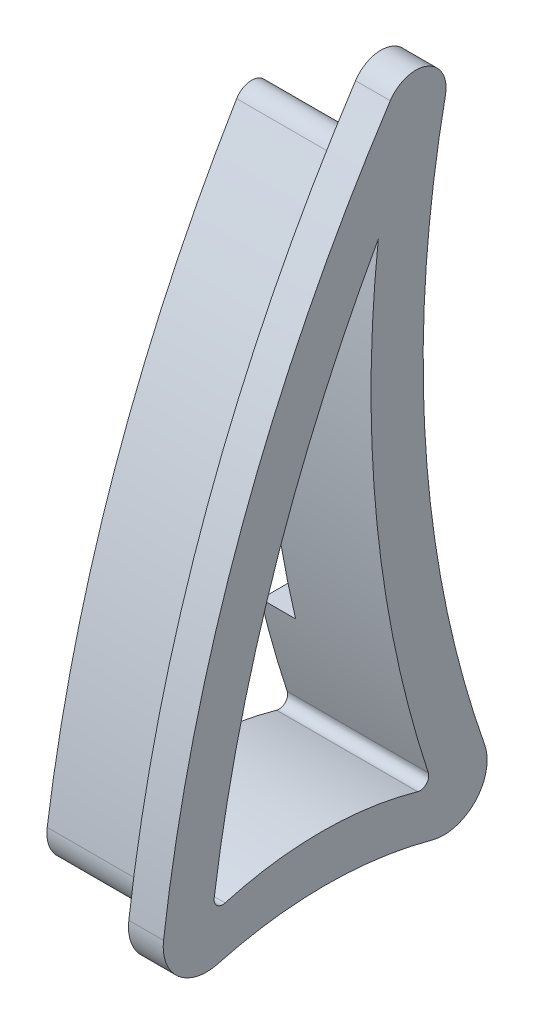
ISO-10303-21;
HEADER;
FILE_DESCRIPTION(('STEP AP214'),'2;1');
FILE_NAME('part.step','',(''),(''),'','','');
FILE_SCHEMA(('AUTOMOTIVE_DESIGN { 1 0 10303 214 1 1 1 1 }'));
ENDSEC;
DATA;
#1=APPLICATION_CONTEXT('core data for automotive mechanical design processes');
#2=APPLICATION_PROTOCOL_DEFINITION('international standard','automotive_design',2000,#1);
#3=PRODUCT_CONTEXT('',#1,'mechanical');
#4=PRODUCT('Part','Part','',(#3));
#5=PRODUCT_RELATED_PRODUCT_CATEGORY('part','',(#4));
#6=PRODUCT_DEFINITION_FORMATION('','',#4);
#7=PRODUCT_DEFINITION_CONTEXT('part definition',#1,'design');
#8=PRODUCT_DEFINITION('design','',#6,#7);
#9=PRODUCT_DEFINITION_SHAPE('','',#8);
#10=(LENGTH_UNIT() NAMED_UNIT(*) SI_UNIT(.MILLI.,.METRE.));
#11=(NAMED_UNIT(*) PLANE_ANGLE_UNIT() SI_UNIT($,.RADIAN.));
#12=(NAMED_UNIT(*) SI_UNIT($,.STERADIAN.) SOLID_ANGLE_UNIT());
#13=UNCERTAINTY_MEASURE_WITH_UNIT(LENGTH_MEASURE(1.E-05),#10,'distance_accuracy_value','');
#14=(GEOMETRIC_REPRESENTATION_CONTEXT(3) GLOBAL_UNCERTAINTY_ASSIGNED_CONTEXT((#13)) GLOBAL_UNIT_ASSIGNED_CONTEXT((#10,
#11,#12)) REPRESENTATION_CONTEXT('',''));
#15=CARTESIAN_POINT('',(0.,0.,0.));
#16=DIRECTION('',(0.,0.,1.));
#17=DIRECTION('',(1.,0.,0.));
#18=AXIS2_PLACEMENT_3D('',#15,#16,#17);
#19=CARTESIAN_POINT('',(0.,-85.725,-146.831685531547));
#20=DIRECTION('',(1.,0.,0.));
#21=DIRECTION('',(0.,0.,-1.));
#22=AXIS2_PLACEMENT_3D('',#19,#20,#21);
#23=CYLINDRICAL_SURFACE('',#22,210.331685531547);
#24=CARTESIAN_POINT('',(15.5575,-85.725,-146.831685531547));
#25=DIRECTION('',(1.,0.,0.));
#26=DIRECTION('',(0.,0.,-1.));
#27=AXIS2_PLACEMENT_3D('',#24,#25,#26);
#28=CIRCLE('',#27,210.331685531547);
#29=CARTESIAN_POINT('',(15.5575,22.1489173700403,33.730314595233));
#30=VERTEX_POINT('',#29);
#31=CARTESIAN_POINT('',(15.5575,-56.286781255573,61.4297108329661));
#32=VERTEX_POINT('',#31);
#33=EDGE_CURVE('E334',#30,#32,#28,.T.);
#34=ORIENTED_EDGE('',*,*,#33,.F.);
#35=DIRECTION('',(1.,0.,0.));
#36=VECTOR('',#35,1.);
#37=CARTESIAN_POINT('',(0.,22.1489173700403,33.730314595233));
#38=LINE('',#37,#36);
#39=CARTESIAN_POINT('',(0.,22.1489173700403,33.730314595233));
#40=VERTEX_POINT('',#39);
#41=EDGE_CURVE('E390',#40,#30,#38,.T.);
#42=ORIENTED_EDGE('',*,*,#41,.F.);
#43=CARTESIAN_POINT('',(0.,-85.725,-146.831685531547));
#44=DIRECTION('',(1.,0.,0.));
#45=DIRECTION('',(0.,0.,-1.));
#46=AXIS2_PLACEMENT_3D('',#43,#44,#45);
#47=CIRCLE('',#46,210.331685531547);
#48=CARTESIAN_POINT('',(0.,-56.286781255573,61.4297108329661));
#49=VERTEX_POINT('',#48);
#50=EDGE_CURVE('E341',#40,#49,#47,.T.);
#51=ORIENTED_EDGE('',*,*,#50,.T.);
#52=DIRECTION('',(1.,0.,0.));
#53=VECTOR('',#52,1.);
#54=CARTESIAN_POINT('',(0.,-56.286781255573,61.4297108329661));
#55=LINE('',#54,#53);
#56=EDGE_CURVE('E367',#49,#32,#55,.T.);
#57=ORIENTED_EDGE('',*,*,#56,.T.);
#58=EDGE_LOOP('',(#34,#42,#51,#57));
#59=FACE_BOUND('',#58,.T.);
#60=ADVANCED_FACE('F45',(#59),#23,.T.);
#61=CARTESIAN_POINT('',(0.,20.8462142160792,31.5498182084761));
#62=DIRECTION('',(1.,0.,0.));
#63=DIRECTION('',(0.,0.,-1.));
#64=AXIS2_PLACEMENT_3D('',#61,#62,#63);
#65=CYLINDRICAL_SURFACE('',#64,2.53999999999998);
#66=CARTESIAN_POINT('',(15.5575,20.8462142160792,31.5498182084761));
#67=DIRECTION('',(1.,0.,0.));
#68=DIRECTION('',(0.,0.,-1.));
#69=AXIS2_PLACEMENT_3D('',#66,#67,#68);
#70=CIRCLE('',#69,2.53999999999998);
#71=CARTESIAN_POINT('',(15.5575,20.4641245910413,29.0387213329179));
#72=VERTEX_POINT('',#71);
#73=EDGE_CURVE('E346',#72,#30,#70,.T.);
#74=ORIENTED_EDGE('',*,*,#73,.F.);
#75=DIRECTION('',(1.,0.,0.));
#76=VECTOR('',#75,1.);
#77=CARTESIAN_POINT('',(0.,20.4641245910413,29.0387213329179));
#78=LINE('',#77,#76);
#79=CARTESIAN_POINT('',(0.,20.4641245910413,29.0387213329179));
#80=VERTEX_POINT('',#79);
#81=EDGE_CURVE('E394',#80,#72,#78,.T.);
#82=ORIENTED_EDGE('',*,*,#81,.F.);
#83=CARTESIAN_POINT('',(0.,20.8462142160792,31.5498182084761));
#84=DIRECTION('',(1.,0.,0.));
#85=DIRECTION('',(0.,0.,-1.));
#86=AXIS2_PLACEMENT_3D('',#83,#84,#85);
#87=CIRCLE('',#86,2.53999999999998);
#88=EDGE_CURVE('E363',#80,#40,#87,.T.);
#89=ORIENTED_EDGE('',*,*,#88,.T.);
#90=ORIENTED_EDGE('',*,*,#41,.T.);
#91=EDGE_LOOP('',(#74,#82,#89,#90));
#92=FACE_BOUND('',#91,.T.);
#93=ADVANCED_FACE('F432',(#92),#65,.T.);
#94=CARTESIAN_POINT('',(0.,-4.22030411994143,-133.187593513881));
#95=DIRECTION('',(1.,0.,0.));
#96=DIRECTION('',(0.,0.,-1.));
#97=AXIS2_PLACEMENT_3D('',#94,#95,#96);
#98=CYLINDRICAL_SURFACE('',#97,164.093565533692);
#99=DIRECTION('',(1.,0.,0.));
#100=VECTOR('',#99,1.);
#101=CARTESIAN_POINT('',(0.,-42.9737697069895,26.2641771083162));
#102=LINE('',#101,#100);
#103=CARTESIAN_POINT('',(5.08,-42.9737697069895,26.2641771083162));
#104=VERTEX_POINT('',#103);
#105=CARTESIAN_POINT('',(0.,-42.9737697069895,26.2641771083162));
#106=VERTEX_POINT('',#105);
#107=EDGE_CURVE('E310',#104,#106,#102,.F.);
#108=ORIENTED_EDGE('',*,*,#107,.F.);
#109=CARTESIAN_POINT('',(5.08,-4.22030411994143,-133.187593513881));
#110=DIRECTION('',(1.,0.,0.));
#111=DIRECTION('',(0.,0.,-1.));
#112=AXIS2_PLACEMENT_3D('',#109,#110,#111);
#113=CIRCLE('',#112,164.093565533692);
#114=CARTESIAN_POINT('',(5.08,4.01623029301051,30.6991287988939));
#115=VERTEX_POINT('',#114);
#116=EDGE_CURVE('E296',#115,#104,#113,.T.);
#117=ORIENTED_EDGE('',*,*,#116,.F.);
#118=DIRECTION('',(1.,0.,0.));
#119=VECTOR('',#118,1.);
#120=CARTESIAN_POINT('',(0.,4.01623029301051,30.6991287988938));
#121=LINE('',#120,#119);
#122=CARTESIAN_POINT('',(0.,4.01623029301051,30.6991287988939));
#123=VERTEX_POINT('',#122);
#124=EDGE_CURVE('E303',#123,#115,#121,.T.);
#125=ORIENTED_EDGE('',*,*,#124,.F.);
#126=CARTESIAN_POINT('',(0.,-4.22030411994143,-133.187593513881));
#127=DIRECTION('',(-1.,0.,0.));
#128=DIRECTION('',(0.,0.,-1.));
#129=AXIS2_PLACEMENT_3D('',#126,#127,#128);
#130=CIRCLE('',#129,164.093565533692);
#131=EDGE_CURVE('E358',#123,#80,#130,.T.);
#132=ORIENTED_EDGE('',*,*,#131,.T.);
#133=ORIENTED_EDGE('',*,*,#81,.T.);
#134=CARTESIAN_POINT('',(15.5575,-4.22030411994143,-133.187593513881));
#135=DIRECTION('',(-1.,0.,0.));
#136=DIRECTION('',(0.,0.,-1.));
#137=AXIS2_PLACEMENT_3D('',#134,#135,#136);
#138=CIRCLE('',#137,164.093565533692);
#139=CARTESIAN_POINT('',(15.5575,-55.4129631360347,22.7162547786557));
#140=VERTEX_POINT('',#139);
#141=EDGE_CURVE('E383',#140,#72,#138,.T.);
#142=ORIENTED_EDGE('',*,*,#141,.F.);
#143=DIRECTION('',(1.,0.,0.));
#144=VECTOR('',#143,1.);
#145=CARTESIAN_POINT('',(0.,-55.4129631360347,22.7162547786557));
#146=LINE('',#145,#144);
#147=CARTESIAN_POINT('',(0.,-55.4129631360347,22.7162547786557));
#148=VERTEX_POINT('',#147);
#149=EDGE_CURVE('E397',#148,#140,#146,.T.);
#150=ORIENTED_EDGE('',*,*,#149,.F.);
#151=EDGE_CURVE('E359',#148,#106,#130,.T.);
#152=ORIENTED_EDGE('',*,*,#151,.T.);
#153=EDGE_LOOP('',(#108,#117,#125,#132,#133,#142,#150,#152));
#154=FACE_BOUND('',#153,.T.);
#155=ADVANCED_FACE('F427',(#154),#98,.F.);
#156=CARTESIAN_POINT('',(0.,-56.9977827903335,27.5427179416094));
#157=DIRECTION('',(1.,0.,0.));
#158=DIRECTION('',(0.,0.,-1.));
#159=AXIS2_PLACEMENT_3D('',#156,#157,#158);
#160=CYLINDRICAL_SURFACE('',#159,5.08000000000003);
#161=CARTESIAN_POINT('',(15.5575,-56.9977827903335,27.5427179416094));
#162=DIRECTION('',(1.,0.,0.));
#163=DIRECTION('',(0.,0.,-1.));
#164=AXIS2_PLACEMENT_3D('',#161,#162,#163);
#165=CIRCLE('',#164,5.08000000000003);
#166=CARTESIAN_POINT('',(15.5575,-61.8834345749108,28.9344099477143));
#167=VERTEX_POINT('',#166);
#168=EDGE_CURVE('E379',#167,#140,#165,.T.);
#169=ORIENTED_EDGE('',*,*,#168,.F.);
#170=DIRECTION('',(1.,0.,0.));
#171=VECTOR('',#170,1.);
#172=CARTESIAN_POINT('',(0.,-61.8834345749108,28.9344099477143));
#173=LINE('',#172,#171);
#174=CARTESIAN_POINT('',(0.,-61.8834345749108,28.9344099477143));
#175=VERTEX_POINT('',#174);
#176=EDGE_CURVE('E400',#175,#167,#173,.T.);
#177=ORIENTED_EDGE('',*,*,#176,.F.);
#178=CARTESIAN_POINT('',(0.,-56.9977827903335,27.5427179416094));
#179=DIRECTION('',(1.,0.,0.));
#180=DIRECTION('',(0.,0.,-1.));
#181=AXIS2_PLACEMENT_3D('',#178,#179,#180);
#182=CIRCLE('',#181,5.08000000000003);
#183=EDGE_CURVE('E354',#175,#148,#182,.T.);
#184=ORIENTED_EDGE('',*,*,#183,.T.);
#185=ORIENTED_EDGE('',*,*,#149,.T.);
#186=EDGE_LOOP('',(#169,#177,#184,#185));
#187=FACE_BOUND('',#186,.T.);
#188=ADVANCED_FACE('F441',(#187),#160,.T.);
#189=CARTESIAN_POINT('',(0.,-107.650236586618,41.9712155394964));
#190=DIRECTION('',(1.,0.,0.));
#191=DIRECTION('',(0.,0.,-1.));
#192=AXIS2_PLACEMENT_3D('',#189,#190,#191);
#193=CYLINDRICAL_SURFACE('',#192,47.5873771752204);
#194=CARTESIAN_POINT('',(15.5575,-107.650236586618,41.9712155394964));
#195=DIRECTION('',(-1.,0.,0.));
#196=DIRECTION('',(0.,0.,-1.));
#197=AXIS2_PLACEMENT_3D('',#194,#195,#196);
#198=CIRCLE('',#197,47.5873771752204);
#199=CARTESIAN_POINT('',(15.5575,-61.8834345749108,55.0080211312785));
#200=VERTEX_POINT('',#199);
#201=EDGE_CURVE('E375',#200,#167,#198,.T.);
#202=ORIENTED_EDGE('',*,*,#201,.F.);
#203=DIRECTION('',(1.,0.,0.));
#204=VECTOR('',#203,1.);
#205=CARTESIAN_POINT('',(0.,-61.8834345749108,55.0080211312785));
#206=LINE('',#205,#204);
#207=CARTESIAN_POINT('',(0.,-61.8834345749108,55.0080211312785));
#208=VERTEX_POINT('',#207);
#209=EDGE_CURVE('E403',#208,#200,#206,.T.);
#210=ORIENTED_EDGE('',*,*,#209,.F.);
#211=CARTESIAN_POINT('',(0.,-107.650236586618,41.9712155394964));
#212=DIRECTION('',(-1.,0.,0.));
#213=DIRECTION('',(0.,0.,-1.));
#214=AXIS2_PLACEMENT_3D('',#211,#212,#213);
#215=CIRCLE('',#214,47.5873771752204);
#216=EDGE_CURVE('E350',#208,#175,#215,.T.);
#217=ORIENTED_EDGE('',*,*,#216,.T.);
#218=ORIENTED_EDGE('',*,*,#176,.T.);
#219=EDGE_LOOP('',(#202,#210,#217,#218));
#220=FACE_BOUND('',#219,.T.);
#221=ADVANCED_FACE('F444',(#220),#193,.F.);
#222=CARTESIAN_POINT('',(0.,-56.9977827903335,56.3997131373834));
#223=DIRECTION('',(1.,0.,0.));
#224=DIRECTION('',(0.,0.,-1.));
#225=AXIS2_PLACEMENT_3D('',#222,#223,#224);
#226=CYLINDRICAL_SURFACE('',#225,5.07999999999998);
#227=CARTESIAN_POINT('',(15.5575,-56.9977827903335,56.3997131373834));
#228=DIRECTION('',(1.,0.,0.));
#229=DIRECTION('',(0.,0.,-1.));
#230=AXIS2_PLACEMENT_3D('',#227,#228,#229);
#231=CIRCLE('',#230,5.07999999999998);
#232=EDGE_CURVE('E371',#32,#200,#231,.T.);
#233=ORIENTED_EDGE('',*,*,#232,.F.);
#234=ORIENTED_EDGE('',*,*,#56,.F.);
#235=CARTESIAN_POINT('',(0.,-56.9977827903335,56.3997131373834));
#236=DIRECTION('',(1.,0.,0.));
#237=DIRECTION('',(0.,0.,-1.));
#238=AXIS2_PLACEMENT_3D('',#235,#236,#237);
#239=CIRCLE('',#238,5.07999999999998);
#240=EDGE_CURVE('E345',#49,#208,#239,.T.);
#241=ORIENTED_EDGE('',*,*,#240,.T.);
#242=ORIENTED_EDGE('',*,*,#209,.T.);
#243=EDGE_LOOP('',(#233,#234,#241,#242));
#244=FACE_BOUND('',#243,.T.);
#245=ADVANCED_FACE('F448',(#244),#226,.T.);
#246=CARTESIAN_POINT('',(0.,-71.3613913951668,-45.2159861970819));
#247=DIRECTION('',(1.,0.,0.));
#248=DIRECTION('',(0.,0.,-1.));
#249=AXIS2_PLACEMENT_3D('',#246,#247,#248);
#250=PLANE('',#249);
#251=CARTESIAN_POINT('',(0.,-4.22030411994143,-133.187593513881));
#252=DIRECTION('',(-1.,0.,0.));
#253=DIRECTION('',(0.,0.,-1.));
#254=AXIS2_PLACEMENT_3D('',#251,#252,#253);
#255=CIRCLE('',#254,167.903565533692);
#256=CARTESIAN_POINT('',(0.,-56.6015778767588,26.336102150871));
#257=VERTEX_POINT('',#256);
#258=CARTESIAN_POINT('',(0.,-42.9737697069894,30.1824656276904));
#259=VERTEX_POINT('',#258);
#260=EDGE_CURVE('E326',#257,#259,#255,.T.);
#261=ORIENTED_EDGE('',*,*,#260,.T.);
#262=DIRECTION('',(0.,0.,-1.));
#263=VECTOR('',#262,1.);
#264=CARTESIAN_POINT('',(0.,-42.9737697069895,-45.2159861970819));
#265=LINE('',#264,#263);
#266=EDGE_CURVE('E306',#259,#106,#265,.T.);
#267=ORIENTED_EDGE('',*,*,#266,.T.);
#268=ORIENTED_EDGE('',*,*,#151,.F.);
#269=ORIENTED_EDGE('',*,*,#183,.F.);
#270=ORIENTED_EDGE('',*,*,#216,.F.);
#271=ORIENTED_EDGE('',*,*,#240,.F.);
#272=ORIENTED_EDGE('',*,*,#50,.F.);
#273=ORIENTED_EDGE('',*,*,#88,.F.);
#274=ORIENTED_EDGE('',*,*,#131,.F.);
#275=DIRECTION('',(0.,0.,1.));
#276=VECTOR('',#275,1.);
#277=CARTESIAN_POINT('',(0.,4.01623029301051,-45.2159861970819));
#278=LINE('',#277,#276);
#279=CARTESIAN_POINT('',(0.,4.01623029301051,34.513828125267));
#280=VERTEX_POINT('',#279);
#281=EDGE_CURVE('E299',#123,#280,#278,.T.);
#282=ORIENTED_EDGE('',*,*,#281,.T.);
#283=CARTESIAN_POINT('',(0.,14.6601962640268,33.6510531606171));
#284=VERTEX_POINT('',#283);
#285=EDGE_CURVE('E325',#280,#284,#255,.T.);
#286=ORIENTED_EDGE('',*,*,#285,.T.);
#287=CARTESIAN_POINT('',(0.,-85.725,-146.831685531547));
#288=DIRECTION('',(1.,0.,0.));
#289=DIRECTION('',(0.,0.,-1.));
#290=AXIS2_PLACEMENT_3D('',#287,#288,#289);
#291=CIRCLE('',#290,206.521685531547);
#292=CARTESIAN_POINT('',(0.,-56.8200324066434,57.6572125612791));
#293=VERTEX_POINT('',#292);
#294=EDGE_CURVE('E313',#284,#293,#291,.T.);
#295=ORIENTED_EDGE('',*,*,#294,.T.);
#296=CARTESIAN_POINT('',(0.,-56.9977827903335,56.3997131373834));
#297=DIRECTION('',(1.,0.,0.));
#298=DIRECTION('',(0.,0.,-1.));
#299=AXIS2_PLACEMENT_3D('',#296,#297,#298);
#300=CIRCLE('',#299,1.26999999999998);
#301=CARTESIAN_POINT('',(0.,-58.2191957364778,56.0517901358572));
#302=VERTEX_POINT('',#301);
#303=EDGE_CURVE('E317',#293,#302,#300,.T.);
#304=ORIENTED_EDGE('',*,*,#303,.T.);
#305=CARTESIAN_POINT('',(0.,-107.650236586618,41.9712155394964));
#306=DIRECTION('',(-1.,0.,0.));
#307=DIRECTION('',(0.,0.,-1.));
#308=AXIS2_PLACEMENT_3D('',#305,#306,#307);
#309=CIRCLE('',#308,51.3973771752205);
#310=CARTESIAN_POINT('',(0.,-58.2191957364778,27.8906409431356));
#311=VERTEX_POINT('',#310);
#312=EDGE_CURVE('E68',#302,#311,#309,.T.);
#313=ORIENTED_EDGE('',*,*,#312,.T.);
#314=CARTESIAN_POINT('',(0.,-56.9977827903335,27.5427179416094));
#315=DIRECTION('',(1.,0.,0.));
#316=DIRECTION('',(0.,0.,-1.));
#317=AXIS2_PLACEMENT_3D('',#314,#315,#316);
#318=CIRCLE('',#317,1.27000000000003);
#319=EDGE_CURVE('E196',#311,#257,#318,.T.);
#320=ORIENTED_EDGE('',*,*,#319,.T.);
#321=EDGE_LOOP('',(#261,#267,#268,#269,#270,#271,#272,#273,#274,#282,#286,#295,#304,#313,#320));
#322=FACE_BOUND('',#321,.T.);
#323=ADVANCED_FACE('F419',(#322),#250,.F.);
#324=CARTESIAN_POINT('',(0.,-85.725,-146.831685531547));
#325=DIRECTION('',(1.,0.,0.));
#326=DIRECTION('',(0.,0.,-1.));
#327=AXIS2_PLACEMENT_3D('',#324,#325,#326);
#328=CYLINDRICAL_SURFACE('',#327,206.521685531547);
#329=DIRECTION('',(1.,0.,0.));
#330=VECTOR('',#329,1.);
#331=CARTESIAN_POINT('',(0.,14.6601962640268,33.6510531606171));
#332=LINE('',#331,#330);
#333=CARTESIAN_POINT('',(20.6375,14.6601962640268,33.6510531606171));
#334=VERTEX_POINT('',#333);
#335=EDGE_CURVE('E331',#284,#334,#332,.T.);
#336=ORIENTED_EDGE('',*,*,#335,.T.);
#337=CARTESIAN_POINT('',(20.6375,-85.725,-146.831685531547));
#338=DIRECTION('',(1.,0.,0.));
#339=DIRECTION('',(0.,0.,-1.));
#340=AXIS2_PLACEMENT_3D('',#337,#338,#339);
#341=CIRCLE('',#340,206.521685531547);
#342=CARTESIAN_POINT('',(20.6375,-56.8200324066434,57.6572125612791));
#343=VERTEX_POINT('',#342);
#344=EDGE_CURVE('E216',#334,#343,#341,.T.);
#345=ORIENTED_EDGE('',*,*,#344,.T.);
#346=DIRECTION('',(1.,0.,0.));
#347=VECTOR('',#346,1.);
#348=CARTESIAN_POINT('',(0.,-56.8200324066434,57.6572125612791));
#349=LINE('',#348,#347);
#350=EDGE_CURVE('E330',#293,#343,#349,.T.);
#351=ORIENTED_EDGE('',*,*,#350,.F.);
#352=ORIENTED_EDGE('',*,*,#294,.F.);
#353=EDGE_LOOP('',(#336,#345,#351,#352));
#354=FACE_BOUND('',#353,.T.);
#355=ADVANCED_FACE('F469',(#354),#328,.F.);
#356=CARTESIAN_POINT('',(0.,-4.22030411994143,-133.187593513881));
#357=DIRECTION('',(1.,0.,0.));
#358=DIRECTION('',(0.,0.,-1.));
#359=AXIS2_PLACEMENT_3D('',#356,#357,#358);
#360=CYLINDRICAL_SURFACE('',#359,167.903565533692);
#361=CARTESIAN_POINT('',(5.08,-4.22030411994143,-133.187593513881));
#362=DIRECTION('',(1.,0.,0.));
#363=DIRECTION('',(0.,0.,-1.));
#364=AXIS2_PLACEMENT_3D('',#361,#362,#363);
#365=CIRCLE('',#364,167.903565533692);
#366=CARTESIAN_POINT('',(5.08,4.01623029301051,34.513828125267));
#367=VERTEX_POINT('',#366);
#368=CARTESIAN_POINT('',(5.08,-42.9737697069894,30.1824656276904));
#369=VERTEX_POINT('',#368);
#370=EDGE_CURVE('E290',#367,#369,#365,.T.);
#371=ORIENTED_EDGE('',*,*,#370,.T.);
#372=DIRECTION('',(1.,0.,0.));
#373=VECTOR('',#372,1.);
#374=CARTESIAN_POINT('',(0.,-42.9737697069895,30.1824656276904));
#375=LINE('',#374,#373);
#376=EDGE_CURVE('E11',#369,#259,#375,.F.);
#377=ORIENTED_EDGE('',*,*,#376,.T.);
#378=ORIENTED_EDGE('',*,*,#260,.F.);
#379=DIRECTION('',(1.,0.,0.));
#380=VECTOR('',#379,1.);
#381=CARTESIAN_POINT('',(0.,-56.6015778767588,26.336102150871));
#382=LINE('',#381,#380);
#383=CARTESIAN_POINT('',(20.6375,-56.6015778767588,26.336102150871));
#384=VERTEX_POINT('',#383);
#385=EDGE_CURVE('E198',#257,#384,#382,.T.);
#386=ORIENTED_EDGE('',*,*,#385,.T.);
#387=CARTESIAN_POINT('',(20.6375,-4.22030411994143,-133.187593513881));
#388=DIRECTION('',(-1.,0.,0.));
#389=DIRECTION('',(0.,0.,-1.));
#390=AXIS2_PLACEMENT_3D('',#387,#388,#389);
#391=CIRCLE('',#390,167.903565533692);
#392=EDGE_CURVE('E212',#384,#334,#391,.T.);
#393=ORIENTED_EDGE('',*,*,#392,.T.);
#394=ORIENTED_EDGE('',*,*,#335,.F.);
#395=ORIENTED_EDGE('',*,*,#285,.F.);
#396=DIRECTION('',(1.,0.,0.));
#397=VECTOR('',#396,1.);
#398=CARTESIAN_POINT('',(0.,4.01623029301051,34.513828125267));
#399=LINE('',#398,#397);
#400=EDGE_CURVE('E53',#280,#367,#399,.T.);
#401=ORIENTED_EDGE('',*,*,#400,.T.);
#402=EDGE_LOOP('',(#371,#377,#378,#386,#393,#394,#395,#401));
#403=FACE_BOUND('',#402,.T.);
#404=ADVANCED_FACE('F411',(#403),#360,.T.);
#405=CARTESIAN_POINT('',(0.,-56.9977827903335,27.5427179416094));
#406=DIRECTION('',(1.,0.,0.));
#407=DIRECTION('',(0.,0.,-1.));
#408=AXIS2_PLACEMENT_3D('',#405,#406,#407);
#409=CYLINDRICAL_SURFACE('',#408,1.27000000000003);
#410=DIRECTION('',(1.,0.,0.));
#411=VECTOR('',#410,1.);
#412=CARTESIAN_POINT('',(0.,-58.2191957364778,27.8906409431356));
#413=LINE('',#412,#411);
#414=CARTESIAN_POINT('',(20.6375,-58.2191957364778,27.8906409431356));
#415=VERTEX_POINT('',#414);
#416=EDGE_CURVE('E189',#311,#415,#413,.T.);
#417=ORIENTED_EDGE('',*,*,#416,.T.);
#418=CARTESIAN_POINT('',(20.6375,-56.9977827903335,27.5427179416094));
#419=DIRECTION('',(1.,0.,0.));
#420=DIRECTION('',(0.,0.,-1.));
#421=AXIS2_PLACEMENT_3D('',#418,#419,#420);
#422=CIRCLE('',#421,1.27000000000002);
#423=EDGE_CURVE('E193',#415,#384,#422,.T.);
#424=ORIENTED_EDGE('',*,*,#423,.T.);
#425=ORIENTED_EDGE('',*,*,#385,.F.);
#426=ORIENTED_EDGE('',*,*,#319,.F.);
#427=EDGE_LOOP('',(#417,#424,#425,#426));
#428=FACE_BOUND('',#427,.T.);
#429=ADVANCED_FACE('F191',(#428),#409,.F.);
#430=CARTESIAN_POINT('',(0.,-107.650236586618,41.9712155394964));
#431=DIRECTION('',(1.,0.,0.));
#432=DIRECTION('',(0.,0.,-1.));
#433=AXIS2_PLACEMENT_3D('',#430,#431,#432);
#434=CYLINDRICAL_SURFACE('',#433,51.3973771752205);
#435=DIRECTION('',(1.,0.,0.));
#436=VECTOR('',#435,1.);
#437=CARTESIAN_POINT('',(0.,-58.2191957364778,56.0517901358572));
#438=LINE('',#437,#436);
#439=CARTESIAN_POINT('',(20.6375,-58.2191957364778,56.0517901358572));
#440=VERTEX_POINT('',#439);
#441=EDGE_CURVE('E199',#302,#440,#438,.T.);
#442=ORIENTED_EDGE('',*,*,#441,.T.);
#443=CARTESIAN_POINT('',(20.6375,-107.650236586618,41.9712155394964));
#444=DIRECTION('',(-1.,0.,0.));
#445=DIRECTION('',(0.,0.,-1.));
#446=AXIS2_PLACEMENT_3D('',#443,#444,#445);
#447=CIRCLE('',#446,51.3973771752205);
#448=EDGE_CURVE('E202',#440,#415,#447,.T.);
#449=ORIENTED_EDGE('',*,*,#448,.T.);
#450=ORIENTED_EDGE('',*,*,#416,.F.);
#451=ORIENTED_EDGE('',*,*,#312,.F.);
#452=EDGE_LOOP('',(#442,#449,#450,#451));
#453=FACE_BOUND('',#452,.T.);
#454=ADVANCED_FACE('F203',(#453),#434,.T.);
#455=CARTESIAN_POINT('',(0.,-56.9977827903335,56.3997131373834));
#456=DIRECTION('',(1.,0.,0.));
#457=DIRECTION('',(0.,0.,-1.));
#458=AXIS2_PLACEMENT_3D('',#455,#456,#457);
#459=CYLINDRICAL_SURFACE('',#458,1.26999999999998);
#460=ORIENTED_EDGE('',*,*,#350,.T.);
#461=CARTESIAN_POINT('',(20.6375,-56.9977827903335,56.3997131373834));
#462=DIRECTION('',(1.,0.,0.));
#463=DIRECTION('',(0.,0.,-1.));
#464=AXIS2_PLACEMENT_3D('',#461,#462,#463);
#465=CIRCLE('',#464,1.26999999999998);
#466=EDGE_CURVE('E222',#343,#440,#465,.T.);
#467=ORIENTED_EDGE('',*,*,#466,.T.);
#468=ORIENTED_EDGE('',*,*,#441,.F.);
#469=ORIENTED_EDGE('',*,*,#303,.F.);
#470=EDGE_LOOP('',(#460,#467,#468,#469));
#471=FACE_BOUND('',#470,.T.);
#472=ADVANCED_FACE('F479',(#471),#459,.F.);
#473=CARTESIAN_POINT('',(-5.08,-42.9737697069895,13.1619216544243));
#474=DIRECTION('',(0.,-1.,0.));
#475=DIRECTION('',(0.,0.,-1.));
#476=AXIS2_PLACEMENT_3D('',#473,#474,#475);
#477=PLANE('',#476);
#478=ORIENTED_EDGE('',*,*,#107,.T.);
#479=ORIENTED_EDGE('',*,*,#266,.F.);
#480=ORIENTED_EDGE('',*,*,#376,.F.);
#481=DIRECTION('',(0.,0.,-1.));
#482=VECTOR('',#481,1.);
#483=CARTESIAN_POINT('',(5.08,-42.9737697069895,13.1619216544243));
#484=LINE('',#483,#482);
#485=EDGE_CURVE('E60',#369,#104,#484,.T.);
#486=ORIENTED_EDGE('',*,*,#485,.T.);
#487=EDGE_LOOP('',(#478,#479,#480,#486));
#488=FACE_BOUND('',#487,.T.);
#489=ADVANCED_FACE('F482',(#488),#477,.F.);
#490=CARTESIAN_POINT('',(-5.08,4.01623029301051,17.9817525383818));
#491=DIRECTION('',(0.,1.,0.));
#492=DIRECTION('',(0.,0.,1.));
#493=AXIS2_PLACEMENT_3D('',#490,#491,#492);
#494=PLANE('',#493);
#495=ORIENTED_EDGE('',*,*,#124,.T.);
#496=DIRECTION('',(0.,0.,1.));
#497=VECTOR('',#496,1.);
#498=CARTESIAN_POINT('',(5.08,4.01623029301051,17.9817525383818));
#499=LINE('',#498,#497);
#500=EDGE_CURVE('E287',#115,#367,#499,.T.);
#501=ORIENTED_EDGE('',*,*,#500,.T.);
#502=ORIENTED_EDGE('',*,*,#400,.F.);
#503=ORIENTED_EDGE('',*,*,#281,.F.);
#504=EDGE_LOOP('',(#495,#501,#502,#503));
#505=FACE_BOUND('',#504,.T.);
#506=ADVANCED_FACE('F414',(#505),#494,.F.);
#507=CARTESIAN_POINT('',(5.08,-4.22030411994143,-133.187593513881));
#508=DIRECTION('',(1.,0.,0.));
#509=DIRECTION('',(0.,0.,-1.));
#510=AXIS2_PLACEMENT_3D('',#507,#508,#509);
#511=PLANE('',#510);
#512=ORIENTED_EDGE('',*,*,#116,.T.);
#513=ORIENTED_EDGE('',*,*,#485,.F.);
#514=ORIENTED_EDGE('',*,*,#370,.F.);
#515=ORIENTED_EDGE('',*,*,#500,.F.);
#516=EDGE_LOOP('',(#512,#513,#514,#515));
#517=FACE_BOUND('',#516,.T.);
#518=ADVANCED_FACE('F490',(#517),#511,.F.);
#519=CARTESIAN_POINT('',(20.6375,-31.7501598146655,-54.5504945335296));
#520=DIRECTION('',(1.,0.,0.));
#521=DIRECTION('',(0.,0.,-1.));
#522=AXIS2_PLACEMENT_3D('',#519,#520,#521);
#523=PLANE('',#522);
#524=CARTESIAN_POINT('',(20.6375,-59.2800155093896,24.0866044468213));
#525=DIRECTION('',(1.,0.,0.));
#526=DIRECTION('',(0.,0.,-1.));
#527=AXIS2_PLACEMENT_3D('',#524,#525,#526);
#528=CIRCLE('',#527,6.35000000000001);
#529=CARTESIAN_POINT('',(20.6375,-65.4051524477252,25.76147682603));
#530=VERTEX_POINT('',#529);
#531=CARTESIAN_POINT('',(20.6375,-57.1818237903129,18.093267186997));
#532=VERTEX_POINT('',#531);
#533=EDGE_CURVE('E226',#530,#532,#528,.T.);
#534=ORIENTED_EDGE('',*,*,#533,.T.);
#535=CARTESIAN_POINT('',(20.6375,-4.22030411994143,-133.187593513881));
#536=DIRECTION('',(-1.,0.,0.));
#537=DIRECTION('',(0.,0.,-1.));
#538=AXIS2_PLACEMENT_3D('',#535,#536,#537);
#539=CIRCLE('',#538,160.283565533692);
#540=CARTESIAN_POINT('',(20.6375,27.9627763458729,23.8317387733394));
#541=VERTEX_POINT('',#540);
#542=EDGE_CURVE('E230',#532,#541,#539,.T.);
#543=ORIENTED_EDGE('',*,*,#542,.T.);
#544=CARTESIAN_POINT('',(20.6375,28.8552807782158,28.1862147278313));
#545=DIRECTION('',(1.,0.,0.));
#546=DIRECTION('',(0.,0.,-1.));
#547=AXIS2_PLACEMENT_3D('',#544,#545,#546);
#548=CIRCLE('',#547,4.445);
#549=CARTESIAN_POINT('',(20.6375,31.2899695701312,31.9051279409249));
#550=VERTEX_POINT('',#549);
#551=EDGE_CURVE('E234',#541,#550,#548,.T.);
#552=ORIENTED_EDGE('',*,*,#551,.T.);
#553=CARTESIAN_POINT('',(20.6375,-85.725,-146.831685531547));
#554=DIRECTION('',(1.,0.,0.));
#555=DIRECTION('',(0.,0.,-1.));
#556=AXIS2_PLACEMENT_3D('',#553,#554,#555);
#557=CIRCLE('',#556,213.633685531547);
#558=CARTESIAN_POINT('',(20.6375,-58.4698907227488,65.0562815927732));
#559=VERTEX_POINT('',#558);
#560=EDGE_CURVE('E237',#550,#559,#557,.T.);
#561=ORIENTED_EDGE('',*,*,#560,.T.);
#562=CARTESIAN_POINT('',(20.6375,-59.2800155093896,58.7581709371821));
#563=DIRECTION('',(1.,0.,0.));
#564=DIRECTION('',(0.,0.,-1.));
#565=AXIS2_PLACEMENT_3D('',#562,#563,#564);
#566=CIRCLE('',#565,6.34999999999998);
#567=CARTESIAN_POINT('',(20.6375,-65.4051524477253,57.0832985579734));
#568=VERTEX_POINT('',#567);
#569=EDGE_CURVE('E240',#559,#568,#566,.T.);
#570=ORIENTED_EDGE('',*,*,#569,.T.);
#571=CARTESIAN_POINT('',(20.6375,-122.678306404963,41.4223876920017));
#572=DIRECTION('',(-1.,0.,0.));
#573=DIRECTION('',(0.,0.,1.));
#574=AXIS2_PLACEMENT_3D('',#571,#572,#573);
#575=CIRCLE('',#574,59.375738255296);
#576=EDGE_CURVE('E243',#568,#530,#575,.T.);
#577=ORIENTED_EDGE('',*,*,#576,.T.);
#578=EDGE_LOOP('',(#534,#543,#552,#561,#570,#577));
#579=FACE_BOUND('',#578,.T.);
#580=ORIENTED_EDGE('',*,*,#423,.F.);
#581=ORIENTED_EDGE('',*,*,#448,.F.);
#582=ORIENTED_EDGE('',*,*,#466,.F.);
#583=ORIENTED_EDGE('',*,*,#344,.F.);
#584=ORIENTED_EDGE('',*,*,#392,.F.);
#585=EDGE_LOOP('',(#580,#581,#582,#583,#584));
#586=FACE_BOUND('',#585,.T.);
#587=ADVANCED_FACE('F209',(#579,#586),#523,.T.);
#588=CARTESIAN_POINT('',(15.5575,-31.7501598146655,-54.5504945335296));
#589=DIRECTION('',(1.,0.,0.));
#590=DIRECTION('',(0.,0.,-1.));
#591=AXIS2_PLACEMENT_3D('',#588,#589,#590);
#592=PLANE('',#591);
#593=ORIENTED_EDGE('',*,*,#73,.T.);
#594=ORIENTED_EDGE('',*,*,#33,.T.);
#595=ORIENTED_EDGE('',*,*,#232,.T.);
#596=ORIENTED_EDGE('',*,*,#201,.T.);
#597=ORIENTED_EDGE('',*,*,#168,.T.);
#598=ORIENTED_EDGE('',*,*,#141,.T.);
#599=EDGE_LOOP('',(#593,#594,#595,#596,#597,#598));
#600=FACE_BOUND('',#599,.T.);
#601=CARTESIAN_POINT('',(15.5575,-59.2800155093896,24.0866044468213));
#602=DIRECTION('',(1.,0.,0.));
#603=DIRECTION('',(0.,0.,-1.));
#604=AXIS2_PLACEMENT_3D('',#601,#602,#603);
#605=CIRCLE('',#604,6.35000000000001);
#606=CARTESIAN_POINT('',(15.5575,-65.4051524477252,25.76147682603));
#607=VERTEX_POINT('',#606);
#608=CARTESIAN_POINT('',(15.5575,-57.1818237903129,18.093267186997));
#609=VERTEX_POINT('',#608);
#610=EDGE_CURVE('E225',#607,#609,#605,.T.);
#611=ORIENTED_EDGE('',*,*,#610,.F.);
#612=CARTESIAN_POINT('',(15.5575,-122.678306404963,41.4223876920017));
#613=DIRECTION('',(-1.,0.,0.));
#614=DIRECTION('',(0.,0.,1.));
#615=AXIS2_PLACEMENT_3D('',#612,#613,#614);
#616=CIRCLE('',#615,59.375738255296);
#617=CARTESIAN_POINT('',(15.5575,-65.4051524477253,57.0832985579734));
#618=VERTEX_POINT('',#617);
#619=EDGE_CURVE('E231',#618,#607,#616,.T.);
#620=ORIENTED_EDGE('',*,*,#619,.F.);
#621=CARTESIAN_POINT('',(15.5575,-59.2800155093896,58.7581709371821));
#622=DIRECTION('',(1.,0.,0.));
#623=DIRECTION('',(0.,0.,-1.));
#624=AXIS2_PLACEMENT_3D('',#621,#622,#623);
#625=CIRCLE('',#624,6.34999999999998);
#626=CARTESIAN_POINT('',(15.5575,-58.4698907227488,65.0562815927732));
#627=VERTEX_POINT('',#626);
#628=EDGE_CURVE('E259',#627,#618,#625,.T.);
#629=ORIENTED_EDGE('',*,*,#628,.F.);
#630=CARTESIAN_POINT('',(15.5575,-85.725,-146.831685531547));
#631=DIRECTION('',(1.,0.,0.));
#632=DIRECTION('',(0.,0.,-1.));
#633=AXIS2_PLACEMENT_3D('',#630,#631,#632);
#634=CIRCLE('',#633,213.633685531547);
#635=CARTESIAN_POINT('',(15.5575,31.2899695701312,31.9051279409249));
#636=VERTEX_POINT('',#635);
#637=EDGE_CURVE('E256',#636,#627,#634,.T.);
#638=ORIENTED_EDGE('',*,*,#637,.F.);
#639=CARTESIAN_POINT('',(15.5575,28.8552807782158,28.1862147278313));
#640=DIRECTION('',(1.,0.,0.));
#641=DIRECTION('',(0.,0.,-1.));
#642=AXIS2_PLACEMENT_3D('',#639,#640,#641);
#643=CIRCLE('',#642,4.445);
#644=CARTESIAN_POINT('',(15.5575,27.9627763458729,23.8317387733394));
#645=VERTEX_POINT('',#644);
#646=EDGE_CURVE('E253',#645,#636,#643,.T.);
#647=ORIENTED_EDGE('',*,*,#646,.F.);
#648=CARTESIAN_POINT('',(15.5575,-4.22030411994143,-133.187593513881));
#649=DIRECTION('',(-1.,0.,0.));
#650=DIRECTION('',(0.,0.,-1.));
#651=AXIS2_PLACEMENT_3D('',#648,#649,#650);
#652=CIRCLE('',#651,160.283565533692);
#653=EDGE_CURVE('E250',#609,#645,#652,.T.);
#654=ORIENTED_EDGE('',*,*,#653,.F.);
#655=EDGE_LOOP('',(#611,#620,#629,#638,#647,#654));
#656=FACE_BOUND('',#655,.T.);
#657=ADVANCED_FACE('F434',(#600,#656),#592,.F.);
#658=CARTESIAN_POINT('',(20.6375,-59.2800155093896,24.0866044468213));
#659=DIRECTION('',(-1.,0.,0.));
#660=DIRECTION('',(0.,0.,1.));
#661=AXIS2_PLACEMENT_3D('',#658,#659,#660);
#662=CYLINDRICAL_SURFACE('',#661,6.35000000000001);
#663=ORIENTED_EDGE('',*,*,#610,.T.);
#664=DIRECTION('',(-1.,0.,0.));
#665=VECTOR('',#664,1.);
#666=CARTESIAN_POINT('',(20.6375,-57.1818237903129,18.093267186997));
#667=LINE('',#666,#665);
#668=EDGE_CURVE('E283',#532,#609,#667,.T.);
#669=ORIENTED_EDGE('',*,*,#668,.F.);
#670=ORIENTED_EDGE('',*,*,#533,.F.);
#671=DIRECTION('',(-1.,0.,0.));
#672=VECTOR('',#671,1.);
#673=CARTESIAN_POINT('',(20.6375,-65.4051524477252,25.76147682603));
#674=LINE('',#673,#672);
#675=EDGE_CURVE('E246',#530,#607,#674,.T.);
#676=ORIENTED_EDGE('',*,*,#675,.T.);
#677=EDGE_LOOP('',(#663,#669,#670,#676));
#678=FACE_BOUND('',#677,.T.);
#679=ADVANCED_FACE('F496',(#678),#662,.T.);
#680=CARTESIAN_POINT('',(20.6375,-4.22030411994143,-133.187593513881));
#681=DIRECTION('',(-1.,0.,0.));
#682=DIRECTION('',(0.,0.,1.));
#683=AXIS2_PLACEMENT_3D('',#680,#681,#682);
#684=CYLINDRICAL_SURFACE('',#683,160.283565533692);
#685=ORIENTED_EDGE('',*,*,#653,.T.);
#686=DIRECTION('',(-1.,0.,0.));
#687=VECTOR('',#686,1.);
#688=CARTESIAN_POINT('',(20.6375,27.9627763458729,23.8317387733394));
#689=LINE('',#688,#687);
#690=EDGE_CURVE('E279',#541,#645,#689,.T.);
#691=ORIENTED_EDGE('',*,*,#690,.F.);
#692=ORIENTED_EDGE('',*,*,#542,.F.);
#693=ORIENTED_EDGE('',*,*,#668,.T.);
#694=EDGE_LOOP('',(#685,#691,#692,#693));
#695=FACE_BOUND('',#694,.T.);
#696=ADVANCED_FACE('F499',(#695),#684,.F.);
#697=CARTESIAN_POINT('',(20.6375,28.8552807782158,28.1862147278313));
#698=DIRECTION('',(-1.,0.,0.));
#699=DIRECTION('',(0.,0.,1.));
#700=AXIS2_PLACEMENT_3D('',#697,#698,#699);
#701=CYLINDRICAL_SURFACE('',#700,4.445);
#702=ORIENTED_EDGE('',*,*,#646,.T.);
#703=DIRECTION('',(-1.,0.,0.));
#704=VECTOR('',#703,1.);
#705=CARTESIAN_POINT('',(20.6375,31.2899695701312,31.9051279409249));
#706=LINE('',#705,#704);
#707=EDGE_CURVE('E275',#550,#636,#706,.T.);
#708=ORIENTED_EDGE('',*,*,#707,.F.);
#709=ORIENTED_EDGE('',*,*,#551,.F.);
#710=ORIENTED_EDGE('',*,*,#690,.T.);
#711=EDGE_LOOP('',(#702,#708,#709,#710));
#712=FACE_BOUND('',#711,.T.);
#713=ADVANCED_FACE('F503',(#712),#701,.T.);
#714=CARTESIAN_POINT('',(20.6375,-85.725,-146.831685531547));
#715=DIRECTION('',(-1.,0.,0.));
#716=DIRECTION('',(0.,0.,1.));
#717=AXIS2_PLACEMENT_3D('',#714,#715,#716);
#718=CYLINDRICAL_SURFACE('',#717,213.633685531547);
#719=ORIENTED_EDGE('',*,*,#637,.T.);
#720=DIRECTION('',(-1.,0.,0.));
#721=VECTOR('',#720,1.);
#722=CARTESIAN_POINT('',(20.6375,-58.4698907227488,65.0562815927732));
#723=LINE('',#722,#721);
#724=EDGE_CURVE('E271',#559,#627,#723,.T.);
#725=ORIENTED_EDGE('',*,*,#724,.F.);
#726=ORIENTED_EDGE('',*,*,#560,.F.);
#727=ORIENTED_EDGE('',*,*,#707,.T.);
#728=EDGE_LOOP('',(#719,#725,#726,#727));
#729=FACE_BOUND('',#728,.T.);
#730=ADVANCED_FACE('F507',(#729),#718,.T.);
#731=CARTESIAN_POINT('',(20.6375,-59.2800155093896,58.7581709371821));
#732=DIRECTION('',(-1.,0.,0.));
#733=DIRECTION('',(0.,0.,1.));
#734=AXIS2_PLACEMENT_3D('',#731,#732,#733);
#735=CYLINDRICAL_SURFACE('',#734,6.34999999999998);
#736=ORIENTED_EDGE('',*,*,#628,.T.);
#737=DIRECTION('',(-1.,0.,0.));
#738=VECTOR('',#737,1.);
#739=CARTESIAN_POINT('',(20.6375,-65.4051524477253,57.0832985579734));
#740=LINE('',#739,#738);
#741=EDGE_CURVE('E267',#568,#618,#740,.T.);
#742=ORIENTED_EDGE('',*,*,#741,.F.);
#743=ORIENTED_EDGE('',*,*,#569,.F.);
#744=ORIENTED_EDGE('',*,*,#724,.T.);
#745=EDGE_LOOP('',(#736,#742,#743,#744));
#746=FACE_BOUND('',#745,.T.);
#747=ADVANCED_FACE('F511',(#746),#735,.T.);
#748=CARTESIAN_POINT('',(20.6375,-122.678306404963,41.4223876920017));
#749=DIRECTION('',(-1.,0.,0.));
#750=DIRECTION('',(0.,0.,1.));
#751=AXIS2_PLACEMENT_3D('',#748,#749,#750);
#752=CYLINDRICAL_SURFACE('',#751,59.375738255296);
#753=ORIENTED_EDGE('',*,*,#619,.T.);
#754=ORIENTED_EDGE('',*,*,#675,.F.);
#755=ORIENTED_EDGE('',*,*,#576,.F.);
#756=ORIENTED_EDGE('',*,*,#741,.T.);
#757=EDGE_LOOP('',(#753,#754,#755,#756));
#758=FACE_BOUND('',#757,.T.);
#759=ADVANCED_FACE('F515',(#758),#752,.F.);
#760=CLOSED_SHELL('',(#60,#93,#155,#188,#221,#245,#323,#355,#404,#429,#454,#472,#489,#506,#518,
#587,#657,#679,#696,#713,#730,#747,#759));
#761=MANIFOLD_SOLID_BREP('B2',#760);
#762=ADVANCED_BREP_SHAPE_REPRESENTATION('',(#18,#761),#14);
#763=SHAPE_DEFINITION_REPRESENTATION(#9,#762);
ENDSEC;
END-ISO-10303-21;
